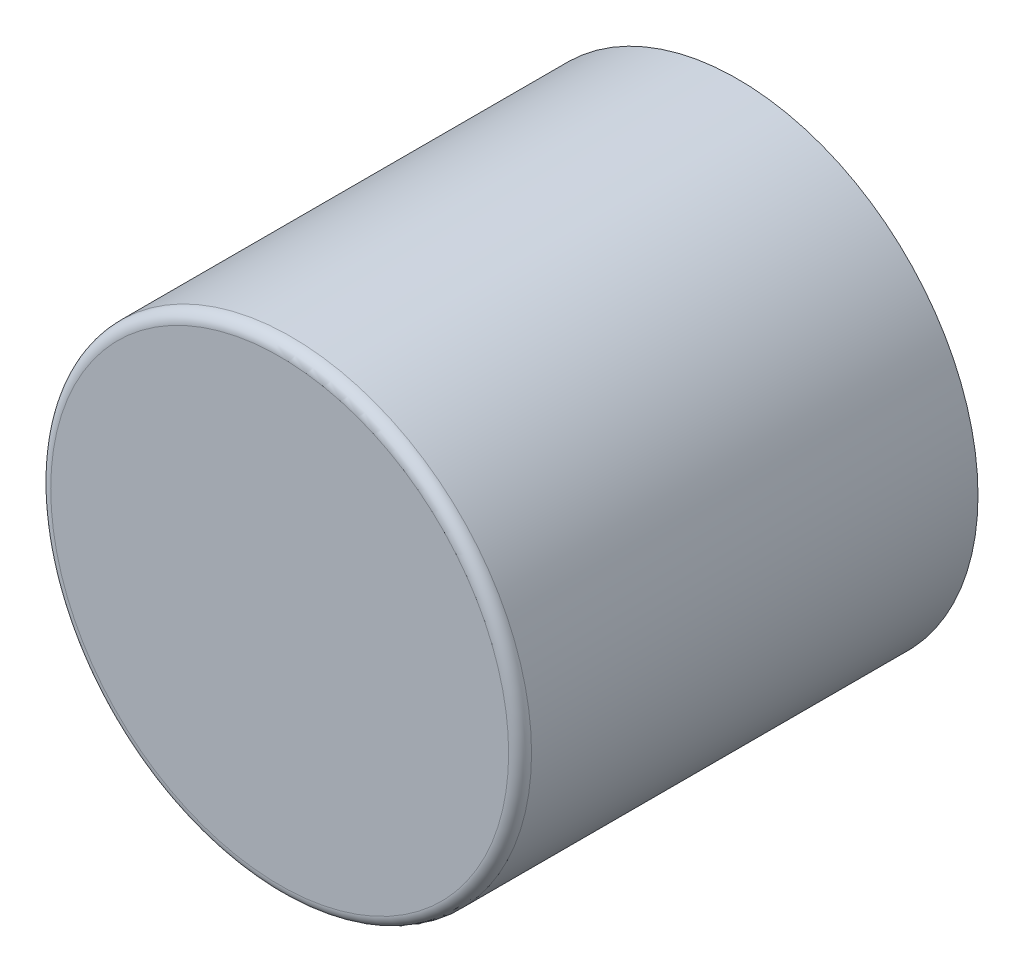
ISO-10303-21;
HEADER;
FILE_DESCRIPTION(('STEP AP214'),'2;1');
FILE_NAME('part.step','',(''),(''),'','','');
FILE_SCHEMA(('AUTOMOTIVE_DESIGN { 1 0 10303 214 1 1 1 1 }'));
ENDSEC;
DATA;
#1=APPLICATION_CONTEXT('core data for automotive mechanical design processes');
#2=APPLICATION_PROTOCOL_DEFINITION('international standard','automotive_design',2000,#1);
#3=PRODUCT_CONTEXT('',#1,'mechanical');
#4=PRODUCT('Part','Part','',(#3));
#5=PRODUCT_RELATED_PRODUCT_CATEGORY('part','',(#4));
#6=PRODUCT_DEFINITION_FORMATION('','',#4);
#7=PRODUCT_DEFINITION_CONTEXT('part definition',#1,'design');
#8=PRODUCT_DEFINITION('design','',#6,#7);
#9=PRODUCT_DEFINITION_SHAPE('','',#8);
#10=(LENGTH_UNIT() NAMED_UNIT(*) SI_UNIT(.MILLI.,.METRE.));
#11=(NAMED_UNIT(*) PLANE_ANGLE_UNIT() SI_UNIT($,.RADIAN.));
#12=(NAMED_UNIT(*) SI_UNIT($,.STERADIAN.) SOLID_ANGLE_UNIT());
#13=UNCERTAINTY_MEASURE_WITH_UNIT(LENGTH_MEASURE(1.E-05),#10,'distance_accuracy_value','');
#14=(GEOMETRIC_REPRESENTATION_CONTEXT(3) GLOBAL_UNCERTAINTY_ASSIGNED_CONTEXT((#13)) GLOBAL_UNIT_ASSIGNED_CONTEXT((#10,
#11,#12)) REPRESENTATION_CONTEXT('',''));
#15=CARTESIAN_POINT('',(0.,0.,0.));
#16=DIRECTION('',(0.,0.,1.));
#17=DIRECTION('',(1.,0.,0.));
#18=AXIS2_PLACEMENT_3D('',#15,#16,#17);
#19=CARTESIAN_POINT('',(-17.5,-8.,28.5));
#20=DIRECTION('',(0.,0.,1.));
#21=DIRECTION('',(1.,0.,0.));
#22=AXIS2_PLACEMENT_3D('',#19,#20,#21);
#23=PLANE('',#22);
#24=CARTESIAN_POINT('',(-17.5,-8.,28.5));
#25=DIRECTION('',(0.,0.,-1.));
#26=DIRECTION('',(-1.,0.,0.));
#27=AXIS2_PLACEMENT_3D('',#24,#25,#26);
#28=CIRCLE('',#27,3.5);
#29=CARTESIAN_POINT('',(-21.,-8.,28.5));
#30=VERTEX_POINT('',#29);
#31=EDGE_CURVE('E41',#30,#30,#28,.T.);
#32=ORIENTED_EDGE('',*,*,#31,.T.);
#33=EDGE_LOOP('',(#32));
#34=FACE_BOUND('',#33,.T.);
#35=ADVANCED_FACE('F16',(#34),#23,.F.);
#36=CARTESIAN_POINT('',(-17.5,-8.,21.5));
#37=DIRECTION('',(0.,0.,-1.));
#38=DIRECTION('',(-1.,0.,0.));
#39=AXIS2_PLACEMENT_3D('',#36,#37,#38);
#40=CYLINDRICAL_SURFACE('',#39,3.5);
#41=CARTESIAN_POINT('',(-17.5,-8.,21.5));
#42=DIRECTION('',(0.,0.,-1.));
#43=DIRECTION('',(-1.,0.,0.));
#44=AXIS2_PLACEMENT_3D('',#41,#42,#43);
#45=CIRCLE('',#44,3.5);
#46=CARTESIAN_POINT('',(-21.,-8.,21.5));
#47=VERTEX_POINT('',#46);
#48=EDGE_CURVE('E40',#47,#47,#45,.F.);
#49=ORIENTED_EDGE('',*,*,#48,.F.);
#50=EDGE_LOOP('',(#49));
#51=FACE_BOUND('',#50,.T.);
#52=ORIENTED_EDGE('',*,*,#31,.F.);
#53=EDGE_LOOP('',(#52));
#54=FACE_BOUND('',#53,.T.);
#55=ADVANCED_FACE('F62',(#51,#54),#40,.F.);
#56=CARTESIAN_POINT('',(-17.5,-8.,29.5));
#57=DIRECTION('',(0.,0.,1.));
#58=DIRECTION('',(1.,0.,0.));
#59=AXIS2_PLACEMENT_3D('',#56,#57,#58);
#60=PLANE('',#59);
#61=CARTESIAN_POINT('',(-17.5,-8.,29.5));
#62=DIRECTION('',(0.,0.,-1.));
#63=DIRECTION('',(1.,0.,0.));
#64=AXIS2_PLACEMENT_3D('',#61,#62,#63);
#65=CIRCLE('',#64,4.);
#66=CARTESIAN_POINT('',(-21.5,-8.,29.5));
#67=VERTEX_POINT('',#66);
#68=CARTESIAN_POINT('',(-13.5,-8.,29.5));
#69=VERTEX_POINT('',#68);
#70=EDGE_CURVE('E33',#67,#69,#65,.F.);
#71=ORIENTED_EDGE('',*,*,#70,.T.);
#72=CARTESIAN_POINT('',(-17.5,-8.,29.5));
#73=DIRECTION('',(0.,0.,-1.));
#74=DIRECTION('',(-1.,0.,0.));
#75=AXIS2_PLACEMENT_3D('',#72,#73,#74);
#76=CIRCLE('',#75,4.);
#77=EDGE_CURVE('E38',#67,#69,#76,.T.);
#78=ORIENTED_EDGE('',*,*,#77,.F.);
#79=EDGE_LOOP('',(#71,#78));
#80=FACE_BOUND('',#79,.T.);
#81=ADVANCED_FACE('F44',(#80),#60,.T.);
#82=CARTESIAN_POINT('',(-17.5,-8.,21.5));
#83=DIRECTION('',(0.,0.,-1.));
#84=DIRECTION('',(-1.,0.,0.));
#85=AXIS2_PLACEMENT_3D('',#82,#83,#84);
#86=PLANE('',#85);
#87=CARTESIAN_POINT('',(-17.5,-8.,21.5));
#88=DIRECTION('',(0.,0.,1.));
#89=DIRECTION('',(1.,0.,0.));
#90=AXIS2_PLACEMENT_3D('',#87,#88,#89);
#91=CIRCLE('',#90,4.2);
#92=CARTESIAN_POINT('',(-13.3,-8.,21.5));
#93=VERTEX_POINT('',#92);
#94=EDGE_CURVE('E27',#93,#93,#91,.T.);
#95=ORIENTED_EDGE('',*,*,#94,.F.);
#96=EDGE_LOOP('',(#95));
#97=FACE_BOUND('',#96,.T.);
#98=ORIENTED_EDGE('',*,*,#48,.T.);
#99=EDGE_LOOP('',(#98));
#100=FACE_BOUND('',#99,.T.);
#101=ADVANCED_FACE('F61',(#97,#100),#86,.T.);
#102=CARTESIAN_POINT('',(-17.5,-8.,29.3));
#103=DIRECTION('',(0.,0.,1.));
#104=DIRECTION('',(-1.,0.,0.));
#105=AXIS2_PLACEMENT_3D('',#102,#103,#104);
#106=TOROIDAL_SURFACE('',#105,4.,0.2);
#107=CARTESIAN_POINT('',(-17.5,-8.,29.3));
#108=DIRECTION('',(0.,0.,1.));
#109=DIRECTION('',(1.,0.,0.));
#110=AXIS2_PLACEMENT_3D('',#107,#108,#109);
#111=CIRCLE('',#110,4.2);
#112=CARTESIAN_POINT('',(-13.3,-8.,29.3));
#113=VERTEX_POINT('',#112);
#114=EDGE_CURVE('E11',#113,#113,#111,.F.);
#115=ORIENTED_EDGE('',*,*,#114,.F.);
#116=EDGE_LOOP('',(#115));
#117=FACE_BOUND('',#116,.T.);
#118=ORIENTED_EDGE('',*,*,#77,.T.);
#119=ORIENTED_EDGE('',*,*,#70,.F.);
#120=EDGE_LOOP('',(#118,#119));
#121=FACE_BOUND('',#120,.T.);
#122=ADVANCED_FACE('F37',(#117,#121),#106,.T.);
#123=CARTESIAN_POINT('',(-17.5,-8.,29.5));
#124=DIRECTION('',(0.,0.,1.));
#125=DIRECTION('',(1.,0.,0.));
#126=AXIS2_PLACEMENT_3D('',#123,#124,#125);
#127=CYLINDRICAL_SURFACE('',#126,4.2);
#128=ORIENTED_EDGE('',*,*,#94,.T.);
#129=EDGE_LOOP('',(#128));
#130=FACE_BOUND('',#129,.T.);
#131=ORIENTED_EDGE('',*,*,#114,.T.);
#132=EDGE_LOOP('',(#131));
#133=FACE_BOUND('',#132,.T.);
#134=ADVANCED_FACE('F73',(#130,#133),#127,.T.);
#135=CLOSED_SHELL('',(#35,#55,#81,#101,#122,#134));
#136=MANIFOLD_SOLID_BREP('B1',#135);
#137=ADVANCED_BREP_SHAPE_REPRESENTATION('',(#18,#136),#14);
#138=SHAPE_DEFINITION_REPRESENTATION(#9,#137);
ENDSEC;
END-ISO-10303-21;
